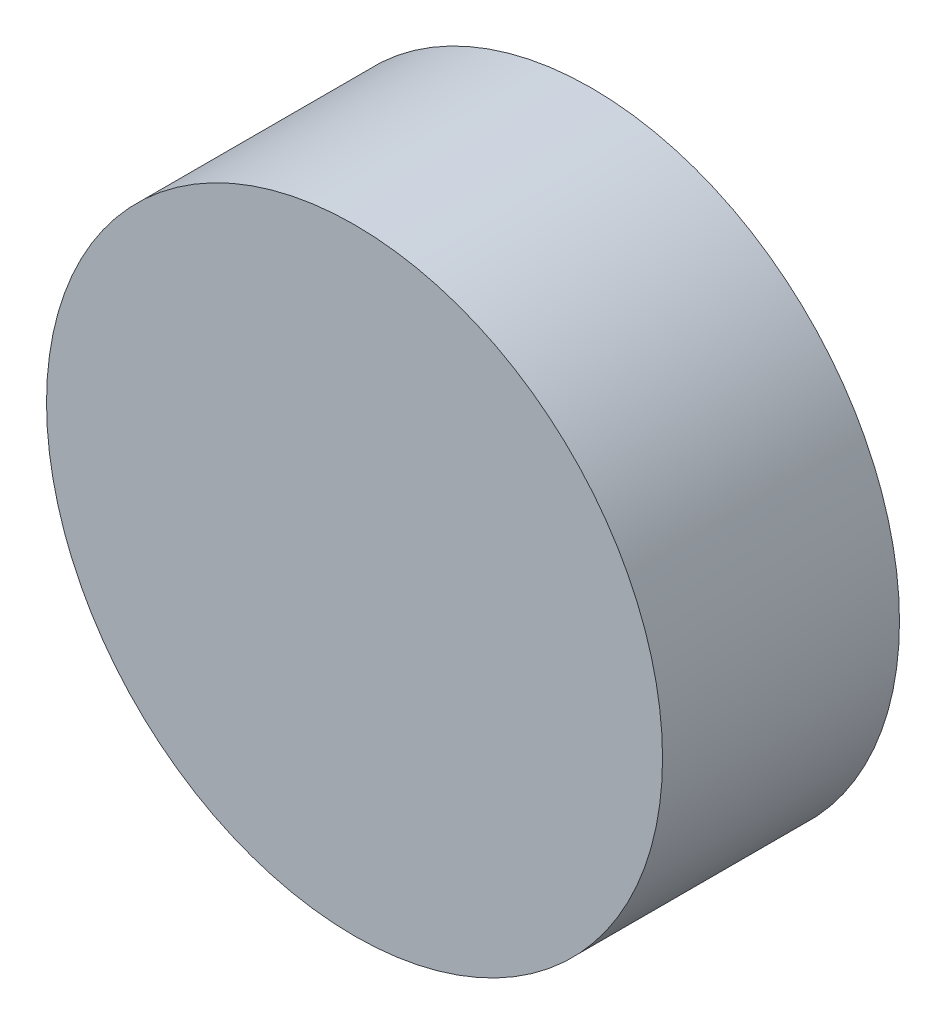
ISO-10303-21;
HEADER;
FILE_DESCRIPTION(('STEP AP214'),'2;1');
FILE_NAME('part.step','',(''),(''),'','','');
FILE_SCHEMA(('AUTOMOTIVE_DESIGN { 1 0 10303 214 1 1 1 1 }'));
ENDSEC;
DATA;
#1=APPLICATION_CONTEXT('core data for automotive mechanical design processes');
#2=APPLICATION_PROTOCOL_DEFINITION('international standard','automotive_design',2000,#1);
#3=PRODUCT_CONTEXT('',#1,'mechanical');
#4=PRODUCT('Part','Part','',(#3));
#5=PRODUCT_RELATED_PRODUCT_CATEGORY('part','',(#4));
#6=PRODUCT_DEFINITION_FORMATION('','',#4);
#7=PRODUCT_DEFINITION_CONTEXT('part definition',#1,'design');
#8=PRODUCT_DEFINITION('design','',#6,#7);
#9=PRODUCT_DEFINITION_SHAPE('','',#8);
#10=(LENGTH_UNIT() NAMED_UNIT(*) SI_UNIT(.MILLI.,.METRE.));
#11=(NAMED_UNIT(*) PLANE_ANGLE_UNIT() SI_UNIT($,.RADIAN.));
#12=(NAMED_UNIT(*) SI_UNIT($,.STERADIAN.) SOLID_ANGLE_UNIT());
#13=UNCERTAINTY_MEASURE_WITH_UNIT(LENGTH_MEASURE(1.E-05),#10,'distance_accuracy_value','');
#14=(GEOMETRIC_REPRESENTATION_CONTEXT(3) GLOBAL_UNCERTAINTY_ASSIGNED_CONTEXT((#13)) GLOBAL_UNIT_ASSIGNED_CONTEXT((#10,
#11,#12)) REPRESENTATION_CONTEXT('',''));
#15=CARTESIAN_POINT('',(0.,0.,0.));
#16=DIRECTION('',(0.,0.,1.));
#17=DIRECTION('',(1.,0.,0.));
#18=AXIS2_PLACEMENT_3D('',#15,#16,#17);
#19=CARTESIAN_POINT('',(0.,0.,25.));
#20=DIRECTION('',(0.,0.,-1.));
#21=DIRECTION('',(-1.,0.,0.));
#22=AXIS2_PLACEMENT_3D('',#19,#20,#21);
#23=CYLINDRICAL_SURFACE('',#22,32.5);
#24=CARTESIAN_POINT('',(0.,0.,25.));
#25=DIRECTION('',(0.,0.,1.));
#26=DIRECTION('',(1.,0.,0.));
#27=AXIS2_PLACEMENT_3D('',#24,#25,#26);
#28=CIRCLE('',#27,32.5);
#29=CARTESIAN_POINT('',(32.5,0.,25.));
#30=VERTEX_POINT('',#29);
#31=EDGE_CURVE('E10',#30,#30,#28,.T.);
#32=ORIENTED_EDGE('',*,*,#31,.F.);
#33=EDGE_LOOP('',(#32));
#34=FACE_BOUND('',#33,.T.);
#35=CARTESIAN_POINT('',(0.,0.,0.));
#36=DIRECTION('',(0.,0.,1.));
#37=DIRECTION('',(1.,0.,0.));
#38=AXIS2_PLACEMENT_3D('',#35,#36,#37);
#39=CIRCLE('',#38,32.5);
#40=CARTESIAN_POINT('',(32.5,0.,0.));
#41=VERTEX_POINT('',#40);
#42=EDGE_CURVE('E34',#41,#41,#39,.T.);
#43=ORIENTED_EDGE('',*,*,#42,.T.);
#44=EDGE_LOOP('',(#43));
#45=FACE_BOUND('',#44,.T.);
#46=ADVANCED_FACE('F31',(#34,#45),#23,.T.);
#47=CARTESIAN_POINT('',(0.,0.,25.));
#48=DIRECTION('',(0.,0.,1.));
#49=DIRECTION('',(1.,0.,0.));
#50=AXIS2_PLACEMENT_3D('',#47,#48,#49);
#51=PLANE('',#50);
#52=ORIENTED_EDGE('',*,*,#31,.T.);
#53=EDGE_LOOP('',(#52));
#54=FACE_BOUND('',#53,.T.);
#55=ADVANCED_FACE('F46',(#54),#51,.T.);
#56=CARTESIAN_POINT('',(0.,0.,0.));
#57=DIRECTION('',(0.,0.,1.));
#58=DIRECTION('',(1.,0.,0.));
#59=AXIS2_PLACEMENT_3D('',#56,#57,#58);
#60=PLANE('',#59);
#61=ORIENTED_EDGE('',*,*,#42,.F.);
#62=EDGE_LOOP('',(#61));
#63=FACE_BOUND('',#62,.T.);
#64=ADVANCED_FACE('F44',(#63),#60,.F.);
#65=CLOSED_SHELL('',(#46,#55,#64));
#66=MANIFOLD_SOLID_BREP('B2',#65);
#67=ADVANCED_BREP_SHAPE_REPRESENTATION('',(#18,#66),#14);
#68=SHAPE_DEFINITION_REPRESENTATION(#9,#67);
ENDSEC;
END-ISO-10303-21;
